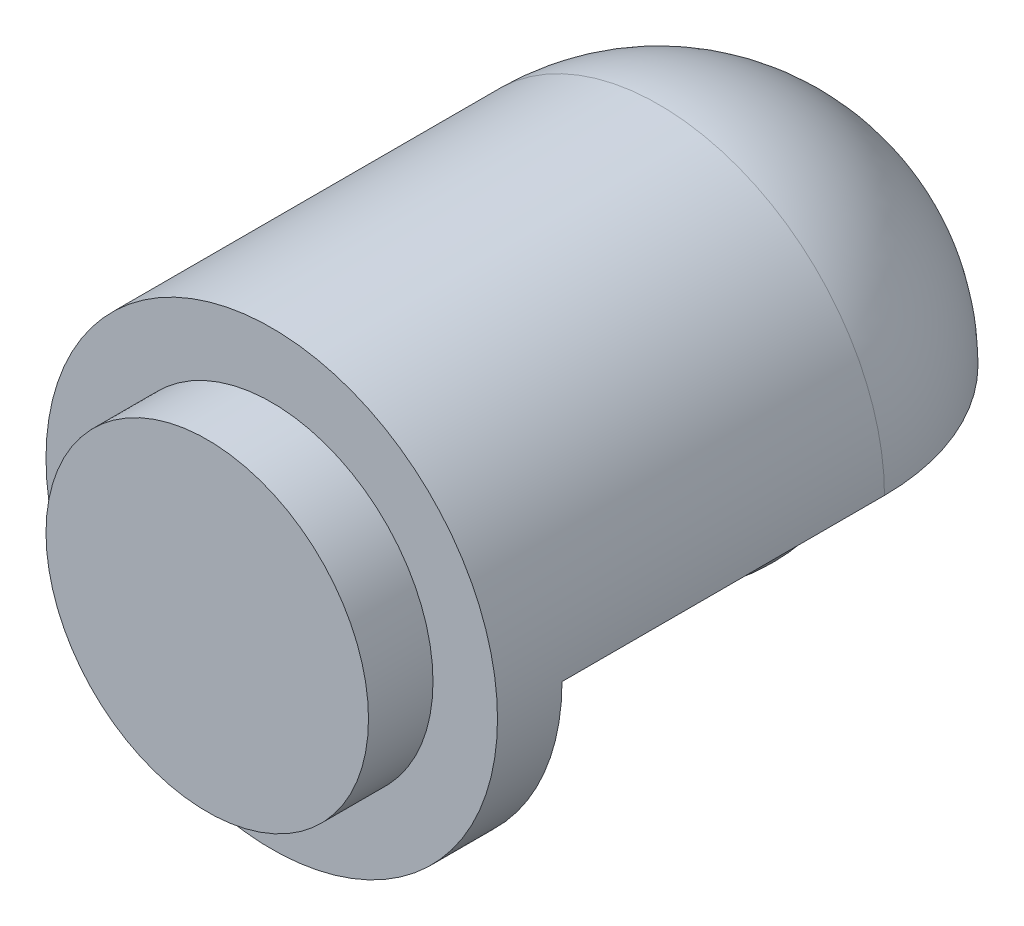
ISO-10303-21;
HEADER;
FILE_DESCRIPTION(('STEP AP214'),'2;1');
FILE_NAME('part.step','',(''),(''),'','','');
FILE_SCHEMA(('AUTOMOTIVE_DESIGN { 1 0 10303 214 1 1 1 1 }'));
ENDSEC;
DATA;
#1=APPLICATION_CONTEXT('core data for automotive mechanical design processes');
#2=APPLICATION_PROTOCOL_DEFINITION('international standard','automotive_design',2000,#1);
#3=PRODUCT_CONTEXT('',#1,'mechanical');
#4=PRODUCT('Part','Part','',(#3));
#5=PRODUCT_RELATED_PRODUCT_CATEGORY('part','',(#4));
#6=PRODUCT_DEFINITION_FORMATION('','',#4);
#7=PRODUCT_DEFINITION_CONTEXT('part definition',#1,'design');
#8=PRODUCT_DEFINITION('design','',#6,#7);
#9=PRODUCT_DEFINITION_SHAPE('','',#8);
#10=(LENGTH_UNIT() NAMED_UNIT(*) SI_UNIT(.MILLI.,.METRE.));
#11=(NAMED_UNIT(*) PLANE_ANGLE_UNIT() SI_UNIT($,.RADIAN.));
#12=(NAMED_UNIT(*) SI_UNIT($,.STERADIAN.) SOLID_ANGLE_UNIT());
#13=UNCERTAINTY_MEASURE_WITH_UNIT(LENGTH_MEASURE(1.E-05),#10,'distance_accuracy_value','');
#14=(GEOMETRIC_REPRESENTATION_CONTEXT(3) GLOBAL_UNCERTAINTY_ASSIGNED_CONTEXT((#13)) GLOBAL_UNIT_ASSIGNED_CONTEXT((#10,
#11,#12)) REPRESENTATION_CONTEXT('',''));
#15=CARTESIAN_POINT('',(0.,0.,0.));
#16=DIRECTION('',(0.,0.,1.));
#17=DIRECTION('',(1.,0.,0.));
#18=AXIS2_PLACEMENT_3D('',#15,#16,#17);
#19=CARTESIAN_POINT('',(0.,0.,0.));
#20=DIRECTION('',(0.,-1.,0.));
#21=DIRECTION('',(0.,0.,1.));
#22=AXIS2_PLACEMENT_3D('',#19,#20,#21);
#23=PLANE('',#22);
#24=CARTESIAN_POINT('',(0.,0.,0.));
#25=DIRECTION('',(0.,-1.,0.));
#26=DIRECTION('',(1.,0.,0.));
#27=AXIS2_PLACEMENT_3D('',#24,#25,#26);
#28=CIRCLE('',#27,50.);
#29=CARTESIAN_POINT('',(50.,-3.49148133884313E-13,0.));
#30=VERTEX_POINT('',#29);
#31=EDGE_CURVE('E42',#30,#30,#28,.F.);
#32=ORIENTED_EDGE('',*,*,#31,.T.);
#33=EDGE_LOOP('',(#32));
#34=FACE_BOUND('',#33,.T.);
#35=DIRECTION('',(0.,0.,1.));
#36=VECTOR('',#35,1.);
#37=CARTESIAN_POINT('',(70.,-4.88807387438039E-13,0.));
#38=LINE('',#37,#36);
#39=CARTESIAN_POINT('',(70.,-4.88807387438039E-13,0.));
#40=VERTEX_POINT('',#39);
#41=CARTESIAN_POINT('',(70.0000000000001,-4.88807387438039E-13,100.));
#42=VERTEX_POINT('',#41);
#43=EDGE_CURVE('E68',#40,#42,#38,.T.);
#44=ORIENTED_EDGE('',*,*,#43,.T.);
#45=DIRECTION('',(-1.,0.,0.));
#46=VECTOR('',#45,1.);
#47=CARTESIAN_POINT('',(0.,0.,100.));
#48=LINE('',#47,#46);
#49=CARTESIAN_POINT('',(-70.0000000000001,4.88807387438039E-13,100.));
#50=VERTEX_POINT('',#49);
#51=EDGE_CURVE('E11',#42,#50,#48,.T.);
#52=ORIENTED_EDGE('',*,*,#51,.T.);
#53=DIRECTION('',(0.,0.,1.));
#54=VECTOR('',#53,1.);
#55=CARTESIAN_POINT('',(-70.,0.,0.));
#56=LINE('',#55,#54);
#57=CARTESIAN_POINT('',(-70.,0.,0.));
#58=VERTEX_POINT('',#57);
#59=EDGE_CURVE('E69',#58,#50,#56,.T.);
#60=ORIENTED_EDGE('',*,*,#59,.F.);
#61=CARTESIAN_POINT('',(0.,0.,0.));
#62=DIRECTION('',(0.,-1.,0.));
#63=DIRECTION('',(0.,0.,1.));
#64=AXIS2_PLACEMENT_3D('',#61,#62,#63);
#65=CIRCLE('',#64,70.);
#66=EDGE_CURVE('E51',#58,#40,#65,.T.);
#67=ORIENTED_EDGE('',*,*,#66,.T.);
#68=EDGE_LOOP('',(#44,#52,#60,#67));
#69=FACE_BOUND('',#68,.T.);
#70=ADVANCED_FACE('F34',(#34,#69),#23,.T.);
#71=CARTESIAN_POINT('',(0.,0.,0.));
#72=DIRECTION('',(0.,0.,-1.));
#73=DIRECTION('',(1.,0.,0.));
#74=AXIS2_PLACEMENT_3D('',#71,#72,#73);
#75=SPHERICAL_SURFACE('',#74,50.);
#76=CARTESIAN_POINT('',(0.,0.,0.));
#77=DIRECTION('',(0.,-1.,0.));
#78=DIRECTION('',(1.,0.,0.));
#79=AXIS2_PLACEMENT_3D('',#76,#77,#78);
#80=SPHERICAL_SURFACE('',#79,50.);
#81=ORIENTED_EDGE('',*,*,#31,.F.);
#82=EDGE_LOOP('',(#81));
#83=FACE_BOUND('',#82,.T.);
#84=ADVANCED_FACE('F36',(#83),#80,.T.);
#85=CARTESIAN_POINT('',(0.,0.,0.));
#86=DIRECTION('',(0.,0.,1.));
#87=DIRECTION('',(-1.,0.,0.));
#88=AXIS2_PLACEMENT_3D('',#85,#86,#87);
#89=SPHERICAL_SURFACE('',#88,70.);
#90=CARTESIAN_POINT('',(0.,0.,0.));
#91=DIRECTION('',(0.,0.,1.));
#92=DIRECTION('',(1.,0.,0.));
#93=AXIS2_PLACEMENT_3D('',#90,#91,#92);
#94=CIRCLE('',#93,70.);
#95=EDGE_CURVE('E48',#40,#58,#94,.T.);
#96=ORIENTED_EDGE('',*,*,#95,.F.);
#97=ORIENTED_EDGE('',*,*,#66,.F.);
#98=EDGE_LOOP('',(#96,#97));
#99=FACE_BOUND('',#98,.T.);
#100=ADVANCED_FACE('F84',(#99),#89,.T.);
#101=CARTESIAN_POINT('',(0.,0.,-70.));
#102=DIRECTION('',(0.,0.,1.));
#103=DIRECTION('',(1.,0.,0.));
#104=AXIS2_PLACEMENT_3D('',#101,#102,#103);
#105=CYLINDRICAL_SURFACE('',#104,70.);
#106=CARTESIAN_POINT('',(0.,0.,120.));
#107=DIRECTION('',(0.,0.,1.));
#108=DIRECTION('',(1.,0.,0.));
#109=AXIS2_PLACEMENT_3D('',#106,#107,#108);
#110=CIRCLE('',#109,70.);
#111=CARTESIAN_POINT('',(70.0000000000001,0.,120.));
#112=VERTEX_POINT('',#111);
#113=EDGE_CURVE('E72',#112,#112,#110,.T.);
#114=ORIENTED_EDGE('',*,*,#113,.F.);
#115=EDGE_LOOP('',(#114));
#116=FACE_BOUND('',#115,.T.);
#117=CARTESIAN_POINT('',(0.,0.,100.));
#118=DIRECTION('',(0.,0.,1.));
#119=DIRECTION('',(1.,0.,0.));
#120=AXIS2_PLACEMENT_3D('',#117,#118,#119);
#121=CIRCLE('',#120,70.0000000000001);
#122=EDGE_CURVE('E60',#50,#42,#121,.T.);
#123=ORIENTED_EDGE('',*,*,#122,.T.);
#124=ORIENTED_EDGE('',*,*,#43,.F.);
#125=ORIENTED_EDGE('',*,*,#95,.T.);
#126=ORIENTED_EDGE('',*,*,#59,.T.);
#127=EDGE_LOOP('',(#123,#124,#125,#126));
#128=FACE_BOUND('',#127,.T.);
#129=ADVANCED_FACE('F67',(#116,#128),#105,.T.);
#130=CARTESIAN_POINT('',(0.,0.,120.));
#131=DIRECTION('',(0.,0.,-1.));
#132=DIRECTION('',(-1.,0.,0.));
#133=AXIS2_PLACEMENT_3D('',#130,#131,#132);
#134=PLANE('',#133);
#135=CARTESIAN_POINT('',(0.,0.,120.));
#136=DIRECTION('',(0.,0.,1.));
#137=DIRECTION('',(1.,0.,0.));
#138=AXIS2_PLACEMENT_3D('',#135,#136,#137);
#139=CIRCLE('',#138,50.);
#140=CARTESIAN_POINT('',(50.,0.,120.));
#141=VERTEX_POINT('',#140);
#142=EDGE_CURVE('E70',#141,#141,#139,.T.);
#143=ORIENTED_EDGE('',*,*,#142,.F.);
#144=EDGE_LOOP('',(#143));
#145=FACE_BOUND('',#144,.T.);
#146=ORIENTED_EDGE('',*,*,#113,.T.);
#147=EDGE_LOOP('',(#146));
#148=FACE_BOUND('',#147,.T.);
#149=ADVANCED_FACE('F96',(#145,#148),#134,.F.);
#150=CARTESIAN_POINT('',(0.,0.,140.));
#151=DIRECTION('',(0.,0.,-1.));
#152=DIRECTION('',(-1.,0.,0.));
#153=AXIS2_PLACEMENT_3D('',#150,#151,#152);
#154=CYLINDRICAL_SURFACE('',#153,50.);
#155=CARTESIAN_POINT('',(0.,0.,140.));
#156=DIRECTION('',(0.,0.,1.));
#157=DIRECTION('',(1.,0.,0.));
#158=AXIS2_PLACEMENT_3D('',#155,#156,#157);
#159=CIRCLE('',#158,50.);
#160=CARTESIAN_POINT('',(50.,0.,140.));
#161=VERTEX_POINT('',#160);
#162=EDGE_CURVE('E172',#161,#161,#159,.T.);
#163=ORIENTED_EDGE('',*,*,#162,.F.);
#164=EDGE_LOOP('',(#163));
#165=FACE_BOUND('',#164,.T.);
#166=ORIENTED_EDGE('',*,*,#142,.T.);
#167=EDGE_LOOP('',(#166));
#168=FACE_BOUND('',#167,.T.);
#169=ADVANCED_FACE('F94',(#165,#168),#154,.T.);
#170=CARTESIAN_POINT('',(0.,0.,140.));
#171=DIRECTION('',(0.,0.,1.));
#172=DIRECTION('',(1.,0.,0.));
#173=AXIS2_PLACEMENT_3D('',#170,#171,#172);
#174=PLANE('',#173);
#175=ORIENTED_EDGE('',*,*,#162,.T.);
#176=EDGE_LOOP('',(#175));
#177=FACE_BOUND('',#176,.T.);
#178=ADVANCED_FACE('F118',(#177),#174,.T.);
#179=CARTESIAN_POINT('',(0.,0.,100.));
#180=DIRECTION('',(0.,0.,1.));
#181=DIRECTION('',(1.,0.,0.));
#182=AXIS2_PLACEMENT_3D('',#179,#180,#181);
#183=PLANE('',#182);
#184=ORIENTED_EDGE('',*,*,#51,.F.);
#185=ORIENTED_EDGE('',*,*,#122,.F.);
#186=EDGE_LOOP('',(#184,#185));
#187=FACE_BOUND('',#186,.T.);
#188=ADVANCED_FACE('F59',(#187),#183,.F.);
#189=CLOSED_SHELL('',(#70,#84,#100,#129,#149,#169,#178,#188));
#190=MANIFOLD_SOLID_BREP('B2',#189);
#191=ADVANCED_BREP_SHAPE_REPRESENTATION('',(#18,#190),#14);
#192=SHAPE_DEFINITION_REPRESENTATION(#9,#191);
ENDSEC;
END-ISO-10303-21;
